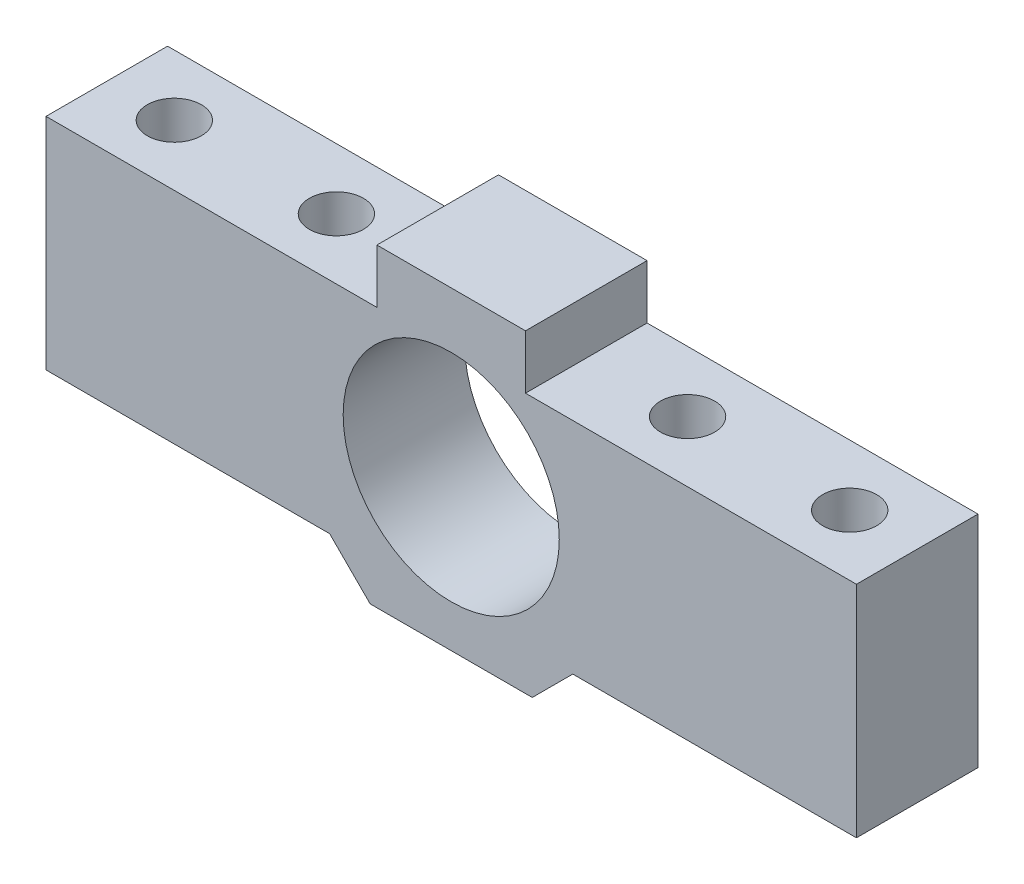
ISO-10303-21;
HEADER;
FILE_DESCRIPTION(('STEP AP214'),'2;1');
FILE_NAME('part.step','',(''),(''),'','','');
FILE_SCHEMA(('AUTOMOTIVE_DESIGN { 1 0 10303 214 1 1 1 1 }'));
ENDSEC;
DATA;
#1=APPLICATION_CONTEXT('core data for automotive mechanical design processes');
#2=APPLICATION_PROTOCOL_DEFINITION('international standard','automotive_design',2000,#1);
#3=PRODUCT_CONTEXT('',#1,'mechanical');
#4=PRODUCT('Part','Part','',(#3));
#5=PRODUCT_RELATED_PRODUCT_CATEGORY('part','',(#4));
#6=PRODUCT_DEFINITION_FORMATION('','',#4);
#7=PRODUCT_DEFINITION_CONTEXT('part definition',#1,'design');
#8=PRODUCT_DEFINITION('design','',#6,#7);
#9=PRODUCT_DEFINITION_SHAPE('','',#8);
#10=(LENGTH_UNIT() NAMED_UNIT(*) SI_UNIT(.MILLI.,.METRE.));
#11=(NAMED_UNIT(*) PLANE_ANGLE_UNIT() SI_UNIT($,.RADIAN.));
#12=(NAMED_UNIT(*) SI_UNIT($,.STERADIAN.) SOLID_ANGLE_UNIT());
#13=UNCERTAINTY_MEASURE_WITH_UNIT(LENGTH_MEASURE(1.E-05),#10,'distance_accuracy_value','');
#14=(GEOMETRIC_REPRESENTATION_CONTEXT(3) GLOBAL_UNCERTAINTY_ASSIGNED_CONTEXT((#13)) GLOBAL_UNIT_ASSIGNED_CONTEXT((#10,
#11,#12)) REPRESENTATION_CONTEXT('',''));
#15=CARTESIAN_POINT('',(0.,0.,0.));
#16=DIRECTION('',(0.,0.,1.));
#17=DIRECTION('',(1.,0.,0.));
#18=AXIS2_PLACEMENT_3D('',#15,#16,#17);
#19=CARTESIAN_POINT('',(0.,0.,9.));
#20=DIRECTION('',(0.,1.,0.));
#21=DIRECTION('',(0.,0.,1.));
#22=AXIS2_PLACEMENT_3D('',#19,#20,#21);
#23=PLANE('',#22);
#24=CARTESIAN_POINT('',(55.,0.,4.5));
#25=DIRECTION('',(0.,-1.,0.));
#26=DIRECTION('',(0.,0.,1.));
#27=AXIS2_PLACEMENT_3D('',#24,#25,#26);
#28=CIRCLE('',#27,2.);
#29=CARTESIAN_POINT('',(55.,0.,6.5));
#30=VERTEX_POINT('',#29);
#31=EDGE_CURVE('E158',#30,#30,#28,.T.);
#32=ORIENTED_EDGE('',*,*,#31,.F.);
#33=EDGE_LOOP('',(#32));
#34=FACE_BOUND('',#33,.T.);
#35=CARTESIAN_POINT('',(43.,0.,4.5));
#36=DIRECTION('',(0.,-1.,0.));
#37=DIRECTION('',(0.,0.,1.));
#38=AXIS2_PLACEMENT_3D('',#35,#36,#37);
#39=CIRCLE('',#38,2.);
#40=CARTESIAN_POINT('',(43.,0.,6.5));
#41=VERTEX_POINT('',#40);
#42=EDGE_CURVE('E163',#41,#41,#39,.T.);
#43=ORIENTED_EDGE('',*,*,#42,.F.);
#44=EDGE_LOOP('',(#43));
#45=FACE_BOUND('',#44,.T.);
#46=DIRECTION('',(1.,0.,0.));
#47=VECTOR('',#46,1.);
#48=CARTESIAN_POINT('',(0.,0.,9.));
#49=LINE('',#48,#47);
#50=CARTESIAN_POINT('',(39.,0.,9.));
#51=VERTEX_POINT('',#50);
#52=CARTESIAN_POINT('',(60.,0.,9.));
#53=VERTEX_POINT('',#52);
#54=EDGE_CURVE('E214',#51,#53,#49,.T.);
#55=ORIENTED_EDGE('',*,*,#54,.F.);
#56=DIRECTION('',(0.,0.,-1.));
#57=VECTOR('',#56,1.);
#58=CARTESIAN_POINT('',(39.,0.,9.));
#59=LINE('',#58,#57);
#60=CARTESIAN_POINT('',(39.,0.,0.));
#61=VERTEX_POINT('',#60);
#62=EDGE_CURVE('E142',#51,#61,#59,.T.);
#63=ORIENTED_EDGE('',*,*,#62,.T.);
#64=DIRECTION('',(1.,0.,0.));
#65=VECTOR('',#64,1.);
#66=CARTESIAN_POINT('',(0.,0.,0.));
#67=LINE('',#66,#65);
#68=CARTESIAN_POINT('',(60.,0.,0.));
#69=VERTEX_POINT('',#68);
#70=EDGE_CURVE('E227',#61,#69,#67,.T.);
#71=ORIENTED_EDGE('',*,*,#70,.T.);
#72=DIRECTION('',(0.,0.,-1.));
#73=VECTOR('',#72,1.);
#74=CARTESIAN_POINT('',(60.,0.,9.));
#75=LINE('',#74,#73);
#76=EDGE_CURVE('E240',#53,#69,#75,.T.);
#77=ORIENTED_EDGE('',*,*,#76,.F.);
#78=EDGE_LOOP('',(#55,#63,#71,#77));
#79=FACE_BOUND('',#78,.T.);
#80=ADVANCED_FACE('F32',(#34,#45,#79),#23,.F.);
#81=CARTESIAN_POINT('',(0.,16.26,9.));
#82=DIRECTION('',(0.,-1.,0.));
#83=DIRECTION('',(0.,0.,-1.));
#84=AXIS2_PLACEMENT_3D('',#81,#82,#83);
#85=PLANE('',#84);
#86=CARTESIAN_POINT('',(5.,16.26,4.5));
#87=DIRECTION('',(0.,-1.,0.));
#88=DIRECTION('',(0.,0.,-1.));
#89=AXIS2_PLACEMENT_3D('',#86,#87,#88);
#90=CIRCLE('',#89,2.);
#91=CARTESIAN_POINT('',(5.,16.26,2.5));
#92=VERTEX_POINT('',#91);
#93=EDGE_CURVE('E156',#92,#92,#90,.T.);
#94=ORIENTED_EDGE('',*,*,#93,.T.);
#95=EDGE_LOOP('',(#94));
#96=FACE_BOUND('',#95,.T.);
#97=CARTESIAN_POINT('',(17.,16.26,4.5));
#98=DIRECTION('',(0.,-1.,0.));
#99=DIRECTION('',(0.,0.,-1.));
#100=AXIS2_PLACEMENT_3D('',#97,#98,#99);
#101=CIRCLE('',#100,2.);
#102=CARTESIAN_POINT('',(17.,16.26,2.5));
#103=VERTEX_POINT('',#102);
#104=EDGE_CURVE('E173',#103,#103,#101,.T.);
#105=ORIENTED_EDGE('',*,*,#104,.T.);
#106=EDGE_LOOP('',(#105));
#107=FACE_BOUND('',#106,.T.);
#108=DIRECTION('',(0.,0.,1.));
#109=VECTOR('',#108,1.);
#110=CARTESIAN_POINT('',(24.5,16.26,0.));
#111=LINE('',#110,#109);
#112=CARTESIAN_POINT('',(24.5,16.26,0.));
#113=VERTEX_POINT('',#112);
#114=CARTESIAN_POINT('',(24.5,16.26,9.));
#115=VERTEX_POINT('',#114);
#116=EDGE_CURVE('E188',#113,#115,#111,.T.);
#117=ORIENTED_EDGE('',*,*,#116,.F.);
#118=DIRECTION('',(-1.,0.,0.));
#119=VECTOR('',#118,1.);
#120=CARTESIAN_POINT('',(0.,16.26,0.));
#121=LINE('',#120,#119);
#122=CARTESIAN_POINT('',(0.,16.26,0.));
#123=VERTEX_POINT('',#122);
#124=EDGE_CURVE('E232',#113,#123,#121,.T.);
#125=ORIENTED_EDGE('',*,*,#124,.T.);
#126=DIRECTION('',(0.,0.,-1.));
#127=VECTOR('',#126,1.);
#128=CARTESIAN_POINT('',(0.,16.26,9.));
#129=LINE('',#128,#127);
#130=CARTESIAN_POINT('',(0.,16.26,9.));
#131=VERTEX_POINT('',#130);
#132=EDGE_CURVE('E224',#131,#123,#129,.T.);
#133=ORIENTED_EDGE('',*,*,#132,.F.);
#134=DIRECTION('',(-1.,0.,0.));
#135=VECTOR('',#134,1.);
#136=CARTESIAN_POINT('',(0.,16.26,9.));
#137=LINE('',#136,#135);
#138=EDGE_CURVE('E220',#115,#131,#137,.T.);
#139=ORIENTED_EDGE('',*,*,#138,.F.);
#140=EDGE_LOOP('',(#117,#125,#133,#139));
#141=FACE_BOUND('',#140,.T.);
#142=ADVANCED_FACE('F254',(#96,#107,#141),#85,.F.);
#143=CARTESIAN_POINT('',(0.,0.,9.));
#144=DIRECTION('',(0.,0.,-1.));
#145=DIRECTION('',(-1.,0.,0.));
#146=AXIS2_PLACEMENT_3D('',#143,#144,#145);
#147=PLANE('',#146);
#148=DIRECTION('',(0.,-1.,0.));
#149=VECTOR('',#148,1.);
#150=CARTESIAN_POINT('',(0.,0.,9.));
#151=LINE('',#150,#149);
#152=CARTESIAN_POINT('',(0.,0.,9.));
#153=VERTEX_POINT('',#152);
#154=EDGE_CURVE('E211',#131,#153,#151,.T.);
#155=ORIENTED_EDGE('',*,*,#154,.T.);
#156=CARTESIAN_POINT('',(21.,0.,9.));
#157=VERTEX_POINT('',#156);
#158=EDGE_CURVE('E216',#153,#157,#49,.T.);
#159=ORIENTED_EDGE('',*,*,#158,.T.);
#160=DIRECTION('',(0.707106781186551,-0.707106781186544,0.));
#161=VECTOR('',#160,1.);
#162=CARTESIAN_POINT('',(10.4999999999999,10.5,9.));
#163=LINE('',#162,#161);
#164=CARTESIAN_POINT('',(24.,-3.,9.));
#165=VERTEX_POINT('',#164);
#166=EDGE_CURVE('E41',#157,#165,#163,.T.);
#167=ORIENTED_EDGE('',*,*,#166,.T.);
#168=DIRECTION('',(1.,0.,0.));
#169=VECTOR('',#168,1.);
#170=CARTESIAN_POINT('',(24.,-3.,9.));
#171=LINE('',#170,#169);
#172=CARTESIAN_POINT('',(36.,-3.,9.));
#173=VERTEX_POINT('',#172);
#174=EDGE_CURVE('E128',#165,#173,#171,.T.);
#175=ORIENTED_EDGE('',*,*,#174,.T.);
#176=DIRECTION('',(0.707106781186544,0.707106781186551,0.));
#177=VECTOR('',#176,1.);
#178=CARTESIAN_POINT('',(19.5000000000002,-19.5,9.));
#179=LINE('',#178,#177);
#180=EDGE_CURVE('E141',#173,#51,#179,.T.);
#181=ORIENTED_EDGE('',*,*,#180,.T.);
#182=ORIENTED_EDGE('',*,*,#54,.T.);
#183=DIRECTION('',(0.,1.,0.));
#184=VECTOR('',#183,1.);
#185=CARTESIAN_POINT('',(60.,0.,9.));
#186=LINE('',#185,#184);
#187=CARTESIAN_POINT('',(60.,16.26,9.));
#188=VERTEX_POINT('',#187);
#189=EDGE_CURVE('E218',#53,#188,#186,.T.);
#190=ORIENTED_EDGE('',*,*,#189,.T.);
#191=CARTESIAN_POINT('',(35.5,16.26,9.));
#192=VERTEX_POINT('',#191);
#193=EDGE_CURVE('E221',#188,#192,#137,.T.);
#194=ORIENTED_EDGE('',*,*,#193,.T.);
#195=DIRECTION('',(0.,1.,0.));
#196=VECTOR('',#195,1.);
#197=CARTESIAN_POINT('',(35.5,16.26,9.));
#198=LINE('',#197,#196);
#199=CARTESIAN_POINT('',(35.5,20.26,9.));
#200=VERTEX_POINT('',#199);
#201=EDGE_CURVE('E191',#192,#200,#198,.T.);
#202=ORIENTED_EDGE('',*,*,#201,.T.);
#203=DIRECTION('',(-1.,0.,0.));
#204=VECTOR('',#203,1.);
#205=CARTESIAN_POINT('',(24.5,20.26,9.));
#206=LINE('',#205,#204);
#207=CARTESIAN_POINT('',(24.5,20.26,9.));
#208=VERTEX_POINT('',#207);
#209=EDGE_CURVE('E182',#200,#208,#206,.T.);
#210=ORIENTED_EDGE('',*,*,#209,.T.);
#211=DIRECTION('',(0.,-1.,0.));
#212=VECTOR('',#211,1.);
#213=CARTESIAN_POINT('',(24.5,16.26,9.));
#214=LINE('',#213,#212);
#215=EDGE_CURVE('E177',#208,#115,#214,.T.);
#216=ORIENTED_EDGE('',*,*,#215,.T.);
#217=ORIENTED_EDGE('',*,*,#138,.T.);
#218=EDGE_LOOP('',(#155,#159,#167,#175,#181,#182,#190,#194,#202,#210,#216,#217));
#219=FACE_BOUND('',#218,.T.);
#220=CARTESIAN_POINT('',(30.,8.13,9.));
#221=DIRECTION('',(0.,0.,1.));
#222=DIRECTION('',(1.,0.,0.));
#223=AXIS2_PLACEMENT_3D('',#220,#221,#222);
#224=CIRCLE('',#223,8.);
#225=CARTESIAN_POINT('',(38.,8.13,9.));
#226=VERTEX_POINT('',#225);
#227=EDGE_CURVE('E205',#226,#226,#224,.T.);
#228=ORIENTED_EDGE('',*,*,#227,.F.);
#229=EDGE_LOOP('',(#228));
#230=FACE_BOUND('',#229,.T.);
#231=ADVANCED_FACE('F260',(#219,#230),#147,.F.);
#232=CARTESIAN_POINT('',(0.,0.,0.));
#233=DIRECTION('',(0.,0.,-1.));
#234=DIRECTION('',(-1.,0.,0.));
#235=AXIS2_PLACEMENT_3D('',#232,#233,#234);
#236=PLANE('',#235);
#237=DIRECTION('',(0.,-1.,0.));
#238=VECTOR('',#237,1.);
#239=CARTESIAN_POINT('',(0.,0.,0.));
#240=LINE('',#239,#238);
#241=CARTESIAN_POINT('',(0.,0.,0.));
#242=VERTEX_POINT('',#241);
#243=EDGE_CURVE('E208',#123,#242,#240,.T.);
#244=ORIENTED_EDGE('',*,*,#243,.F.);
#245=ORIENTED_EDGE('',*,*,#124,.F.);
#246=DIRECTION('',(0.,-1.,0.));
#247=VECTOR('',#246,1.);
#248=CARTESIAN_POINT('',(24.5,16.26,0.));
#249=LINE('',#248,#247);
#250=CARTESIAN_POINT('',(24.5,20.26,0.));
#251=VERTEX_POINT('',#250);
#252=EDGE_CURVE('E179',#251,#113,#249,.T.);
#253=ORIENTED_EDGE('',*,*,#252,.F.);
#254=DIRECTION('',(-1.,0.,0.));
#255=VECTOR('',#254,1.);
#256=CARTESIAN_POINT('',(24.5,20.26,0.));
#257=LINE('',#256,#255);
#258=CARTESIAN_POINT('',(35.5,20.26,0.));
#259=VERTEX_POINT('',#258);
#260=EDGE_CURVE('E185',#259,#251,#257,.T.);
#261=ORIENTED_EDGE('',*,*,#260,.F.);
#262=DIRECTION('',(0.,1.,0.));
#263=VECTOR('',#262,1.);
#264=CARTESIAN_POINT('',(35.5,16.26,0.));
#265=LINE('',#264,#263);
#266=CARTESIAN_POINT('',(35.5,16.26,0.));
#267=VERTEX_POINT('',#266);
#268=EDGE_CURVE('E181',#267,#259,#265,.T.);
#269=ORIENTED_EDGE('',*,*,#268,.F.);
#270=CARTESIAN_POINT('',(60.,16.26,0.));
#271=VERTEX_POINT('',#270);
#272=EDGE_CURVE('E215',#271,#267,#121,.T.);
#273=ORIENTED_EDGE('',*,*,#272,.F.);
#274=DIRECTION('',(0.,1.,0.));
#275=VECTOR('',#274,1.);
#276=CARTESIAN_POINT('',(60.,0.,0.));
#277=LINE('',#276,#275);
#278=EDGE_CURVE('E230',#69,#271,#277,.T.);
#279=ORIENTED_EDGE('',*,*,#278,.F.);
#280=ORIENTED_EDGE('',*,*,#70,.F.);
#281=DIRECTION('',(-0.707106781186544,-0.707106781186551,0.));
#282=VECTOR('',#281,1.);
#283=CARTESIAN_POINT('',(36.,-3.00000000000003,0.));
#284=LINE('',#283,#282);
#285=CARTESIAN_POINT('',(36.,-3.,0.));
#286=VERTEX_POINT('',#285);
#287=EDGE_CURVE('E136',#61,#286,#284,.T.);
#288=ORIENTED_EDGE('',*,*,#287,.T.);
#289=DIRECTION('',(1.,0.,0.));
#290=VECTOR('',#289,1.);
#291=CARTESIAN_POINT('',(24.,-3.,0.));
#292=LINE('',#291,#290);
#293=CARTESIAN_POINT('',(24.,-3.,0.));
#294=VERTEX_POINT('',#293);
#295=EDGE_CURVE('E125',#294,#286,#292,.T.);
#296=ORIENTED_EDGE('',*,*,#295,.F.);
#297=DIRECTION('',(-0.707106781186551,0.707106781186544,0.));
#298=VECTOR('',#297,1.);
#299=CARTESIAN_POINT('',(21.,0.,0.));
#300=LINE('',#299,#298);
#301=CARTESIAN_POINT('',(21.,0.,0.));
#302=VERTEX_POINT('',#301);
#303=EDGE_CURVE('E11',#294,#302,#300,.T.);
#304=ORIENTED_EDGE('',*,*,#303,.T.);
#305=EDGE_CURVE('E228',#242,#302,#67,.T.);
#306=ORIENTED_EDGE('',*,*,#305,.F.);
#307=EDGE_LOOP('',(#244,#245,#253,#261,#269,#273,#279,#280,#288,#296,#304,#306));
#308=FACE_BOUND('',#307,.T.);
#309=CARTESIAN_POINT('',(30.,8.13,0.));
#310=DIRECTION('',(0.,0.,1.));
#311=DIRECTION('',(1.,0.,0.));
#312=AXIS2_PLACEMENT_3D('',#309,#310,#311);
#313=CIRCLE('',#312,8.);
#314=CARTESIAN_POINT('',(38.,8.13,0.));
#315=VERTEX_POINT('',#314);
#316=EDGE_CURVE('E198',#315,#315,#313,.T.);
#317=ORIENTED_EDGE('',*,*,#316,.T.);
#318=EDGE_LOOP('',(#317));
#319=FACE_BOUND('',#318,.T.);
#320=ADVANCED_FACE('F132',(#308,#319),#236,.T.);
#321=CARTESIAN_POINT('',(0.,0.,9.));
#322=DIRECTION('',(1.,0.,0.));
#323=DIRECTION('',(0.,0.,-1.));
#324=AXIS2_PLACEMENT_3D('',#321,#322,#323);
#325=PLANE('',#324);
#326=ORIENTED_EDGE('',*,*,#243,.T.);
#327=DIRECTION('',(0.,0.,-1.));
#328=VECTOR('',#327,1.);
#329=CARTESIAN_POINT('',(0.,0.,9.));
#330=LINE('',#329,#328);
#331=EDGE_CURVE('E145',#153,#242,#330,.T.);
#332=ORIENTED_EDGE('',*,*,#331,.F.);
#333=ORIENTED_EDGE('',*,*,#154,.F.);
#334=ORIENTED_EDGE('',*,*,#132,.T.);
#335=EDGE_LOOP('',(#326,#332,#333,#334));
#336=FACE_BOUND('',#335,.T.);
#337=ADVANCED_FACE('F247',(#336),#325,.F.);
#338=CARTESIAN_POINT('',(5.,0.,4.5));
#339=DIRECTION('',(0.,-1.,0.));
#340=DIRECTION('',(0.,0.,-1.));
#341=AXIS2_PLACEMENT_3D('',#338,#339,#340);
#342=CIRCLE('',#341,2.);
#343=CARTESIAN_POINT('',(5.,0.,2.5));
#344=VERTEX_POINT('',#343);
#345=EDGE_CURVE('E152',#344,#344,#342,.T.);
#346=ORIENTED_EDGE('',*,*,#345,.F.);
#347=EDGE_LOOP('',(#346));
#348=FACE_BOUND('',#347,.T.);
#349=CARTESIAN_POINT('',(17.,0.,4.5));
#350=DIRECTION('',(0.,-1.,0.));
#351=DIRECTION('',(0.,0.,-1.));
#352=AXIS2_PLACEMENT_3D('',#349,#350,#351);
#353=CIRCLE('',#352,2.);
#354=CARTESIAN_POINT('',(17.,0.,2.5));
#355=VERTEX_POINT('',#354);
#356=EDGE_CURVE('E170',#355,#355,#353,.T.);
#357=ORIENTED_EDGE('',*,*,#356,.F.);
#358=EDGE_LOOP('',(#357));
#359=FACE_BOUND('',#358,.T.);
#360=ORIENTED_EDGE('',*,*,#305,.T.);
#361=DIRECTION('',(0.,0.,1.));
#362=VECTOR('',#361,1.);
#363=CARTESIAN_POINT('',(21.,0.,9.));
#364=LINE('',#363,#362);
#365=EDGE_CURVE('E138',#302,#157,#364,.T.);
#366=ORIENTED_EDGE('',*,*,#365,.T.);
#367=ORIENTED_EDGE('',*,*,#158,.F.);
#368=ORIENTED_EDGE('',*,*,#331,.T.);
#369=EDGE_LOOP('',(#360,#366,#367,#368));
#370=FACE_BOUND('',#369,.T.);
#371=ADVANCED_FACE('F244',(#348,#359,#370),#23,.F.);
#372=CARTESIAN_POINT('',(60.,0.,9.));
#373=DIRECTION('',(-1.,0.,0.));
#374=DIRECTION('',(0.,0.,1.));
#375=AXIS2_PLACEMENT_3D('',#372,#373,#374);
#376=PLANE('',#375);
#377=ORIENTED_EDGE('',*,*,#278,.T.);
#378=DIRECTION('',(0.,0.,-1.));
#379=VECTOR('',#378,1.);
#380=CARTESIAN_POINT('',(60.,16.26,9.));
#381=LINE('',#380,#379);
#382=EDGE_CURVE('E237',#188,#271,#381,.T.);
#383=ORIENTED_EDGE('',*,*,#382,.F.);
#384=ORIENTED_EDGE('',*,*,#189,.F.);
#385=ORIENTED_EDGE('',*,*,#76,.T.);
#386=EDGE_LOOP('',(#377,#383,#384,#385));
#387=FACE_BOUND('',#386,.T.);
#388=ADVANCED_FACE('F275',(#387),#376,.F.);
#389=CARTESIAN_POINT('',(55.,16.26,4.5));
#390=DIRECTION('',(0.,-1.,0.));
#391=DIRECTION('',(0.,0.,-1.));
#392=AXIS2_PLACEMENT_3D('',#389,#390,#391);
#393=CIRCLE('',#392,2.);
#394=CARTESIAN_POINT('',(55.,16.26,2.5));
#395=VERTEX_POINT('',#394);
#396=EDGE_CURVE('E36',#395,#395,#393,.T.);
#397=ORIENTED_EDGE('',*,*,#396,.T.);
#398=EDGE_LOOP('',(#397));
#399=FACE_BOUND('',#398,.T.);
#400=CARTESIAN_POINT('',(43.,16.26,4.5));
#401=DIRECTION('',(0.,-1.,0.));
#402=DIRECTION('',(0.,0.,-1.));
#403=AXIS2_PLACEMENT_3D('',#400,#401,#402);
#404=CIRCLE('',#403,2.);
#405=CARTESIAN_POINT('',(43.,16.26,2.5));
#406=VERTEX_POINT('',#405);
#407=EDGE_CURVE('E150',#406,#406,#404,.T.);
#408=ORIENTED_EDGE('',*,*,#407,.T.);
#409=EDGE_LOOP('',(#408));
#410=FACE_BOUND('',#409,.T.);
#411=ORIENTED_EDGE('',*,*,#272,.T.);
#412=DIRECTION('',(0.,0.,1.));
#413=VECTOR('',#412,1.);
#414=CARTESIAN_POINT('',(35.5,16.26,0.));
#415=LINE('',#414,#413);
#416=EDGE_CURVE('E201',#267,#192,#415,.T.);
#417=ORIENTED_EDGE('',*,*,#416,.T.);
#418=ORIENTED_EDGE('',*,*,#193,.F.);
#419=ORIENTED_EDGE('',*,*,#382,.T.);
#420=EDGE_LOOP('',(#411,#417,#418,#419));
#421=FACE_BOUND('',#420,.T.);
#422=ADVANCED_FACE('F270',(#399,#410,#421),#85,.F.);
#423=CARTESIAN_POINT('',(30.,8.13,9.));
#424=DIRECTION('',(0.,0.,-1.));
#425=DIRECTION('',(-1.,0.,0.));
#426=AXIS2_PLACEMENT_3D('',#423,#424,#425);
#427=CYLINDRICAL_SURFACE('',#426,8.);
#428=ORIENTED_EDGE('',*,*,#227,.T.);
#429=EDGE_LOOP('',(#428));
#430=FACE_BOUND('',#429,.T.);
#431=ORIENTED_EDGE('',*,*,#316,.F.);
#432=EDGE_LOOP('',(#431));
#433=FACE_BOUND('',#432,.T.);
#434=ADVANCED_FACE('F328',(#430,#433),#427,.F.);
#435=CARTESIAN_POINT('',(24.5,16.26,0.));
#436=DIRECTION('',(-1.,0.,0.));
#437=DIRECTION('',(0.,0.,1.));
#438=AXIS2_PLACEMENT_3D('',#435,#436,#437);
#439=PLANE('',#438);
#440=ORIENTED_EDGE('',*,*,#215,.F.);
#441=DIRECTION('',(0.,0.,1.));
#442=VECTOR('',#441,1.);
#443=CARTESIAN_POINT('',(24.5,20.26,0.));
#444=LINE('',#443,#442);
#445=EDGE_CURVE('E196',#251,#208,#444,.T.);
#446=ORIENTED_EDGE('',*,*,#445,.F.);
#447=ORIENTED_EDGE('',*,*,#252,.T.);
#448=ORIENTED_EDGE('',*,*,#116,.T.);
#449=EDGE_LOOP('',(#440,#446,#447,#448));
#450=FACE_BOUND('',#449,.T.);
#451=ADVANCED_FACE('F258',(#450),#439,.T.);
#452=CARTESIAN_POINT('',(24.5,20.26,0.));
#453=DIRECTION('',(0.,1.,0.));
#454=DIRECTION('',(0.,0.,1.));
#455=AXIS2_PLACEMENT_3D('',#452,#453,#454);
#456=PLANE('',#455);
#457=ORIENTED_EDGE('',*,*,#209,.F.);
#458=DIRECTION('',(0.,0.,1.));
#459=VECTOR('',#458,1.);
#460=CARTESIAN_POINT('',(35.5,20.26,0.));
#461=LINE('',#460,#459);
#462=EDGE_CURVE('E199',#259,#200,#461,.T.);
#463=ORIENTED_EDGE('',*,*,#462,.F.);
#464=ORIENTED_EDGE('',*,*,#260,.T.);
#465=ORIENTED_EDGE('',*,*,#445,.T.);
#466=EDGE_LOOP('',(#457,#463,#464,#465));
#467=FACE_BOUND('',#466,.T.);
#468=ADVANCED_FACE('F264',(#467),#456,.T.);
#469=CARTESIAN_POINT('',(35.5,16.26,0.));
#470=DIRECTION('',(1.,0.,0.));
#471=DIRECTION('',(0.,0.,-1.));
#472=AXIS2_PLACEMENT_3D('',#469,#470,#471);
#473=PLANE('',#472);
#474=ORIENTED_EDGE('',*,*,#201,.F.);
#475=ORIENTED_EDGE('',*,*,#416,.F.);
#476=ORIENTED_EDGE('',*,*,#268,.T.);
#477=ORIENTED_EDGE('',*,*,#462,.T.);
#478=EDGE_LOOP('',(#474,#475,#476,#477));
#479=FACE_BOUND('',#478,.T.);
#480=ADVANCED_FACE('F321',(#479),#473,.T.);
#481=CARTESIAN_POINT('',(24.,-3.,0.));
#482=DIRECTION('',(0.,-1.,0.));
#483=DIRECTION('',(0.,0.,-1.));
#484=AXIS2_PLACEMENT_3D('',#481,#482,#483);
#485=PLANE('',#484);
#486=ORIENTED_EDGE('',*,*,#174,.F.);
#487=DIRECTION('',(0.,0.,1.));
#488=VECTOR('',#487,1.);
#489=CARTESIAN_POINT('',(24.,-3.,0.));
#490=LINE('',#489,#488);
#491=EDGE_CURVE('E122',#294,#165,#490,.T.);
#492=ORIENTED_EDGE('',*,*,#491,.F.);
#493=ORIENTED_EDGE('',*,*,#295,.T.);
#494=DIRECTION('',(0.,0.,1.));
#495=VECTOR('',#494,1.);
#496=CARTESIAN_POINT('',(36.,-3.,0.));
#497=LINE('',#496,#495);
#498=EDGE_CURVE('E129',#286,#173,#497,.T.);
#499=ORIENTED_EDGE('',*,*,#498,.T.);
#500=EDGE_LOOP('',(#486,#492,#493,#499));
#501=FACE_BOUND('',#500,.T.);
#502=ADVANCED_FACE('F123',(#501),#485,.T.);
#503=CARTESIAN_POINT('',(36.,-3.00000000000003,0.));
#504=DIRECTION('',(-0.707106781186551,0.707106781186544,0.));
#505=DIRECTION('',(0.,0.,1.));
#506=AXIS2_PLACEMENT_3D('',#503,#504,#505);
#507=PLANE('',#506);
#508=ORIENTED_EDGE('',*,*,#287,.F.);
#509=ORIENTED_EDGE('',*,*,#62,.F.);
#510=ORIENTED_EDGE('',*,*,#180,.F.);
#511=ORIENTED_EDGE('',*,*,#498,.F.);
#512=EDGE_LOOP('',(#508,#509,#510,#511));
#513=FACE_BOUND('',#512,.T.);
#514=ADVANCED_FACE('F280',(#513),#507,.F.);
#515=CARTESIAN_POINT('',(21.,0.,9.));
#516=DIRECTION('',(0.707106781186544,0.707106781186551,0.));
#517=DIRECTION('',(0.,0.,1.));
#518=AXIS2_PLACEMENT_3D('',#515,#516,#517);
#519=PLANE('',#518);
#520=ORIENTED_EDGE('',*,*,#303,.F.);
#521=ORIENTED_EDGE('',*,*,#491,.T.);
#522=ORIENTED_EDGE('',*,*,#166,.F.);
#523=ORIENTED_EDGE('',*,*,#365,.F.);
#524=EDGE_LOOP('',(#520,#521,#522,#523));
#525=FACE_BOUND('',#524,.T.);
#526=ADVANCED_FACE('F34',(#525),#519,.F.);
#527=CARTESIAN_POINT('',(17.,20.26,4.5));
#528=DIRECTION('',(0.,-1.,0.));
#529=DIRECTION('',(0.,0.,-1.));
#530=AXIS2_PLACEMENT_3D('',#527,#528,#529);
#531=CYLINDRICAL_SURFACE('',#530,2.);
#532=ORIENTED_EDGE('',*,*,#356,.T.);
#533=EDGE_LOOP('',(#532));
#534=FACE_BOUND('',#533,.T.);
#535=ORIENTED_EDGE('',*,*,#104,.F.);
#536=EDGE_LOOP('',(#535));
#537=FACE_BOUND('',#536,.T.);
#538=ADVANCED_FACE('F303',(#534,#537),#531,.F.);
#539=CARTESIAN_POINT('',(43.,20.26,4.5));
#540=DIRECTION('',(0.,-1.,0.));
#541=DIRECTION('',(0.,0.,-1.));
#542=AXIS2_PLACEMENT_3D('',#539,#540,#541);
#543=CYLINDRICAL_SURFACE('',#542,2.);
#544=ORIENTED_EDGE('',*,*,#42,.T.);
#545=EDGE_LOOP('',(#544));
#546=FACE_BOUND('',#545,.T.);
#547=ORIENTED_EDGE('',*,*,#407,.F.);
#548=EDGE_LOOP('',(#547));
#549=FACE_BOUND('',#548,.T.);
#550=ADVANCED_FACE('F306',(#546,#549),#543,.F.);
#551=CARTESIAN_POINT('',(55.,20.26,4.5));
#552=DIRECTION('',(0.,-1.,0.));
#553=DIRECTION('',(0.,0.,-1.));
#554=AXIS2_PLACEMENT_3D('',#551,#552,#553);
#555=CYLINDRICAL_SURFACE('',#554,2.);
#556=ORIENTED_EDGE('',*,*,#31,.T.);
#557=EDGE_LOOP('',(#556));
#558=FACE_BOUND('',#557,.T.);
#559=ORIENTED_EDGE('',*,*,#396,.F.);
#560=EDGE_LOOP('',(#559));
#561=FACE_BOUND('',#560,.T.);
#562=ADVANCED_FACE('F314',(#558,#561),#555,.F.);
#563=CARTESIAN_POINT('',(5.,20.26,4.5));
#564=DIRECTION('',(0.,-1.,0.));
#565=DIRECTION('',(0.,0.,-1.));
#566=AXIS2_PLACEMENT_3D('',#563,#564,#565);
#567=CYLINDRICAL_SURFACE('',#566,2.);
#568=ORIENTED_EDGE('',*,*,#345,.T.);
#569=EDGE_LOOP('',(#568));
#570=FACE_BOUND('',#569,.T.);
#571=ORIENTED_EDGE('',*,*,#93,.F.);
#572=EDGE_LOOP('',(#571));
#573=FACE_BOUND('',#572,.T.);
#574=ADVANCED_FACE('F342',(#570,#573),#567,.F.);
#575=CLOSED_SHELL('',(#80,#142,#231,#320,#337,#371,#388,#422,#434,#451,#468,#480,#502,#514,#526,
#538,#550,#562,#574));
#576=MANIFOLD_SOLID_BREP('B2',#575);
#577=ADVANCED_BREP_SHAPE_REPRESENTATION('',(#18,#576),#14);
#578=SHAPE_DEFINITION_REPRESENTATION(#9,#577);
ENDSEC;
END-ISO-10303-21;
